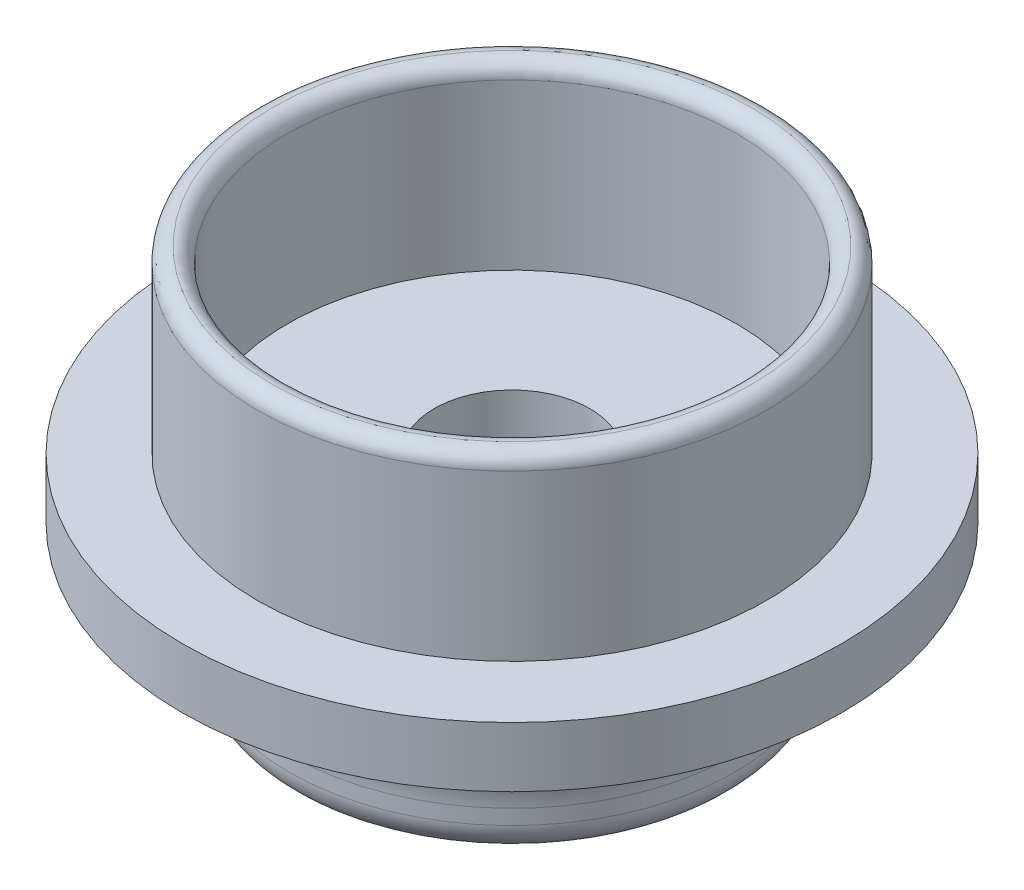
ISO-10303-21;
HEADER;
FILE_DESCRIPTION(('STEP AP214'),'2;1');
FILE_NAME('part.step','',(''),(''),'','','');
FILE_SCHEMA(('AUTOMOTIVE_DESIGN { 1 0 10303 214 1 1 1 1 }'));
ENDSEC;
DATA;
#1=APPLICATION_CONTEXT('core data for automotive mechanical design processes');
#2=APPLICATION_PROTOCOL_DEFINITION('international standard','automotive_design',2000,#1);
#3=PRODUCT_CONTEXT('',#1,'mechanical');
#4=PRODUCT('Part','Part','',(#3));
#5=PRODUCT_RELATED_PRODUCT_CATEGORY('part','',(#4));
#6=PRODUCT_DEFINITION_FORMATION('','',#4);
#7=PRODUCT_DEFINITION_CONTEXT('part definition',#1,'design');
#8=PRODUCT_DEFINITION('design','',#6,#7);
#9=PRODUCT_DEFINITION_SHAPE('','',#8);
#10=(LENGTH_UNIT() NAMED_UNIT(*) SI_UNIT(.MILLI.,.METRE.));
#11=(NAMED_UNIT(*) PLANE_ANGLE_UNIT() SI_UNIT($,.RADIAN.));
#12=(NAMED_UNIT(*) SI_UNIT($,.STERADIAN.) SOLID_ANGLE_UNIT());
#13=UNCERTAINTY_MEASURE_WITH_UNIT(LENGTH_MEASURE(1.E-05),#10,'distance_accuracy_value','');
#14=(GEOMETRIC_REPRESENTATION_CONTEXT(3) GLOBAL_UNCERTAINTY_ASSIGNED_CONTEXT((#13)) GLOBAL_UNIT_ASSIGNED_CONTEXT((#10,
#11,#12)) REPRESENTATION_CONTEXT('',''));
#15=CARTESIAN_POINT('',(0.,0.,0.));
#16=DIRECTION('',(0.,0.,1.));
#17=DIRECTION('',(1.,0.,0.));
#18=AXIS2_PLACEMENT_3D('',#15,#16,#17);
#19=CARTESIAN_POINT('',(0.,0.,0.));
#20=DIRECTION('',(0.,1.,0.));
#21=DIRECTION('',(0.,0.,1.));
#22=AXIS2_PLACEMENT_3D('',#19,#20,#21);
#23=PLANE('',#22);
#24=CARTESIAN_POINT('',(0.,0.,0.));
#25=DIRECTION('',(0.,1.,0.));
#26=DIRECTION('',(0.,0.,1.));
#27=AXIS2_PLACEMENT_3D('',#24,#25,#26);
#28=CIRCLE('',#27,2.6);
#29=CARTESIAN_POINT('',(0.,0.,2.6));
#30=VERTEX_POINT('',#29);
#31=EDGE_CURVE('E148',#30,#30,#28,.T.);
#32=ORIENTED_EDGE('',*,*,#31,.T.);
#33=EDGE_LOOP('',(#32));
#34=FACE_BOUND('',#33,.T.);
#35=DIRECTION('',(0.866025403784438,0.,-0.500000000000001));
#36=VECTOR('',#35,1.);
#37=CARTESIAN_POINT('',(-2.3,0.,-3.98371685740842));
#38=LINE('',#37,#36);
#39=CARTESIAN_POINT('',(-4.6,0.,-2.65581123827228));
#40=VERTEX_POINT('',#39);
#41=CARTESIAN_POINT('',(0.,0.,-5.31162247654456));
#42=VERTEX_POINT('',#41);
#43=EDGE_CURVE('E128',#40,#42,#38,.T.);
#44=ORIENTED_EDGE('',*,*,#43,.T.);
#45=DIRECTION('',(0.866025403784439,0.,0.5));
#46=VECTOR('',#45,1.);
#47=CARTESIAN_POINT('',(2.3,0.,-3.98371685740842));
#48=LINE('',#47,#46);
#49=CARTESIAN_POINT('',(4.6,0.,-2.65581123827228));
#50=VERTEX_POINT('',#49);
#51=EDGE_CURVE('E57',#42,#50,#48,.T.);
#52=ORIENTED_EDGE('',*,*,#51,.T.);
#53=DIRECTION('',(0.,0.,1.));
#54=VECTOR('',#53,1.);
#55=CARTESIAN_POINT('',(4.6,0.,0.));
#56=LINE('',#55,#54);
#57=CARTESIAN_POINT('',(4.6,0.,2.65581123827228));
#58=VERTEX_POINT('',#57);
#59=EDGE_CURVE('E137',#50,#58,#56,.T.);
#60=ORIENTED_EDGE('',*,*,#59,.T.);
#61=DIRECTION('',(-0.866025403784438,0.,0.500000000000001));
#62=VECTOR('',#61,1.);
#63=CARTESIAN_POINT('',(2.3,0.,3.98371685740842));
#64=LINE('',#63,#62);
#65=CARTESIAN_POINT('',(0.,0.,5.31162247654456));
#66=VERTEX_POINT('',#65);
#67=EDGE_CURVE('E135',#58,#66,#64,.T.);
#68=ORIENTED_EDGE('',*,*,#67,.T.);
#69=DIRECTION('',(-0.866025403784439,0.,-0.5));
#70=VECTOR('',#69,1.);
#71=CARTESIAN_POINT('',(-2.3,0.,3.98371685740842));
#72=LINE('',#71,#70);
#73=CARTESIAN_POINT('',(-4.6,0.,2.65581123827228));
#74=VERTEX_POINT('',#73);
#75=EDGE_CURVE('E103',#66,#74,#72,.T.);
#76=ORIENTED_EDGE('',*,*,#75,.T.);
#77=DIRECTION('',(0.,0.,-1.));
#78=VECTOR('',#77,1.);
#79=CARTESIAN_POINT('',(-4.6,0.,0.));
#80=LINE('',#79,#78);
#81=EDGE_CURVE('E131',#74,#40,#80,.T.);
#82=ORIENTED_EDGE('',*,*,#81,.T.);
#83=EDGE_LOOP('',(#44,#52,#60,#68,#76,#82));
#84=FACE_BOUND('',#83,.T.);
#85=ADVANCED_FACE('F41',(#34,#84),#23,.F.);
#86=CARTESIAN_POINT('',(0.,2.,0.));
#87=DIRECTION('',(0.,-1.,0.));
#88=DIRECTION('',(0.,0.,-1.));
#89=AXIS2_PLACEMENT_3D('',#86,#87,#88);
#90=CYLINDRICAL_SURFACE('',#89,11.);
#91=CARTESIAN_POINT('',(0.,2.,0.));
#92=DIRECTION('',(0.,1.,0.));
#93=DIRECTION('',(0.,0.,1.));
#94=AXIS2_PLACEMENT_3D('',#91,#92,#93);
#95=CIRCLE('',#94,11.);
#96=CARTESIAN_POINT('',(0.,2.,11.));
#97=VERTEX_POINT('',#96);
#98=EDGE_CURVE('E157',#97,#97,#95,.T.);
#99=ORIENTED_EDGE('',*,*,#98,.F.);
#100=EDGE_LOOP('',(#99));
#101=FACE_BOUND('',#100,.T.);
#102=CARTESIAN_POINT('',(0.,0.,0.));
#103=DIRECTION('',(0.,1.,0.));
#104=DIRECTION('',(0.,0.,1.));
#105=AXIS2_PLACEMENT_3D('',#102,#103,#104);
#106=CIRCLE('',#105,11.);
#107=CARTESIAN_POINT('',(0.,0.,11.));
#108=VERTEX_POINT('',#107);
#109=EDGE_CURVE('E156',#108,#108,#106,.T.);
#110=ORIENTED_EDGE('',*,*,#109,.T.);
#111=EDGE_LOOP('',(#110));
#112=FACE_BOUND('',#111,.T.);
#113=ADVANCED_FACE('F200',(#101,#112),#90,.T.);
#114=CARTESIAN_POINT('',(0.,2.,0.));
#115=DIRECTION('',(0.,1.,0.));
#116=DIRECTION('',(0.,0.,1.));
#117=AXIS2_PLACEMENT_3D('',#114,#115,#116);
#118=PLANE('',#117);
#119=CARTESIAN_POINT('',(0.,2.,0.));
#120=DIRECTION('',(0.,1.,0.));
#121=DIRECTION('',(0.,0.,1.));
#122=AXIS2_PLACEMENT_3D('',#119,#120,#121);
#123=CIRCLE('',#122,8.5);
#124=CARTESIAN_POINT('',(0.,2.,8.5));
#125=VERTEX_POINT('',#124);
#126=EDGE_CURVE('E151',#125,#125,#123,.T.);
#127=ORIENTED_EDGE('',*,*,#126,.F.);
#128=EDGE_LOOP('',(#127));
#129=FACE_BOUND('',#128,.T.);
#130=ORIENTED_EDGE('',*,*,#98,.T.);
#131=EDGE_LOOP('',(#130));
#132=FACE_BOUND('',#131,.T.);
#133=ADVANCED_FACE('F209',(#129,#132),#118,.T.);
#134=CARTESIAN_POINT('',(0.,0.,0.));
#135=DIRECTION('',(0.,1.,0.));
#136=DIRECTION('',(0.,0.,1.));
#137=AXIS2_PLACEMENT_3D('',#134,#135,#136);
#138=CIRCLE('',#137,10.4336220595155);
#139=CARTESIAN_POINT('',(0.,0.,10.4336220595155));
#140=VERTEX_POINT('',#139);
#141=EDGE_CURVE('E168',#140,#140,#138,.T.);
#142=ORIENTED_EDGE('',*,*,#141,.T.);
#143=EDGE_LOOP('',(#142));
#144=FACE_BOUND('',#143,.T.);
#145=ORIENTED_EDGE('',*,*,#109,.F.);
#146=EDGE_LOOP('',(#145));
#147=FACE_BOUND('',#146,.T.);
#148=ADVANCED_FACE('F203',(#144,#147),#23,.F.);
#149=CARTESIAN_POINT('',(0.,8.,0.));
#150=DIRECTION('',(0.,-1.,0.));
#151=DIRECTION('',(0.,0.,-1.));
#152=AXIS2_PLACEMENT_3D('',#149,#150,#151);
#153=CYLINDRICAL_SURFACE('',#152,8.5);
#154=CARTESIAN_POINT('',(0.,7.5,0.));
#155=DIRECTION('',(0.,1.,0.));
#156=DIRECTION('',(0.,0.,1.));
#157=AXIS2_PLACEMENT_3D('',#154,#155,#156);
#158=CIRCLE('',#157,8.5);
#159=CARTESIAN_POINT('',(0.,7.5,8.5));
#160=VERTEX_POINT('',#159);
#161=EDGE_CURVE('E50',#160,#160,#158,.F.);
#162=ORIENTED_EDGE('',*,*,#161,.T.);
#163=EDGE_LOOP('',(#162));
#164=FACE_BOUND('',#163,.T.);
#165=ORIENTED_EDGE('',*,*,#126,.T.);
#166=EDGE_LOOP('',(#165));
#167=FACE_BOUND('',#166,.T.);
#168=ADVANCED_FACE('F180',(#164,#167),#153,.T.);
#169=CARTESIAN_POINT('',(0.,8.,0.));
#170=DIRECTION('',(0.,-1.,0.));
#171=DIRECTION('',(0.,0.,-1.));
#172=AXIS2_PLACEMENT_3D('',#169,#170,#171);
#173=CYLINDRICAL_SURFACE('',#172,7.5);
#174=CARTESIAN_POINT('',(0.,7.5,0.));
#175=DIRECTION('',(0.,1.,0.));
#176=DIRECTION('',(0.,0.,1.));
#177=AXIS2_PLACEMENT_3D('',#174,#175,#176);
#178=CIRCLE('',#177,7.5);
#179=CARTESIAN_POINT('',(0.,7.5,7.5));
#180=VERTEX_POINT('',#179);
#181=EDGE_CURVE('E11',#180,#180,#178,.T.);
#182=ORIENTED_EDGE('',*,*,#181,.T.);
#183=EDGE_LOOP('',(#182));
#184=FACE_BOUND('',#183,.T.);
#185=CARTESIAN_POINT('',(0.,2.,0.));
#186=DIRECTION('',(0.,1.,0.));
#187=DIRECTION('',(0.,0.,1.));
#188=AXIS2_PLACEMENT_3D('',#185,#186,#187);
#189=CIRCLE('',#188,7.5);
#190=CARTESIAN_POINT('',(0.,2.,7.5));
#191=VERTEX_POINT('',#190);
#192=EDGE_CURVE('E160',#191,#191,#189,.F.);
#193=ORIENTED_EDGE('',*,*,#192,.T.);
#194=EDGE_LOOP('',(#193));
#195=FACE_BOUND('',#194,.T.);
#196=ADVANCED_FACE('F221',(#184,#195),#173,.F.);
#197=CARTESIAN_POINT('',(0.,2.,0.));
#198=DIRECTION('',(0.,1.,0.));
#199=DIRECTION('',(0.,0.,1.));
#200=AXIS2_PLACEMENT_3D('',#197,#198,#199);
#201=CIRCLE('',#200,2.6);
#202=CARTESIAN_POINT('',(0.,2.,2.6));
#203=VERTEX_POINT('',#202);
#204=EDGE_CURVE('E147',#203,#203,#201,.T.);
#205=ORIENTED_EDGE('',*,*,#204,.F.);
#206=EDGE_LOOP('',(#205));
#207=FACE_BOUND('',#206,.T.);
#208=ORIENTED_EDGE('',*,*,#192,.F.);
#209=EDGE_LOOP('',(#208));
#210=FACE_BOUND('',#209,.T.);
#211=ADVANCED_FACE('F225',(#207,#210),#118,.T.);
#212=CARTESIAN_POINT('',(0.,0.,0.));
#213=DIRECTION('',(0.,1.,0.));
#214=DIRECTION('',(0.,0.,1.));
#215=AXIS2_PLACEMENT_3D('',#212,#213,#214);
#216=CYLINDRICAL_SURFACE('',#215,2.6);
#217=ORIENTED_EDGE('',*,*,#31,.F.);
#218=EDGE_LOOP('',(#217));
#219=FACE_BOUND('',#218,.T.);
#220=ORIENTED_EDGE('',*,*,#204,.T.);
#221=EDGE_LOOP('',(#220));
#222=FACE_BOUND('',#221,.T.);
#223=ADVANCED_FACE('F264',(#219,#222),#216,.F.);
#224=CARTESIAN_POINT('',(2.3,-4.5,-3.98371685740842));
#225=DIRECTION('',(-0.5,0.,0.866025403784439));
#226=DIRECTION('',(0.866025403784439,0.,0.5));
#227=AXIS2_PLACEMENT_3D('',#224,#225,#226);
#228=PLANE('',#227);
#229=ORIENTED_EDGE('',*,*,#51,.F.);
#230=DIRECTION('',(0.,1.,0.));
#231=VECTOR('',#230,1.);
#232=CARTESIAN_POINT('',(0.,-4.5,-5.31162247654456));
#233=LINE('',#232,#231);
#234=CARTESIAN_POINT('',(0.,-4.5,-5.31162247654456));
#235=VERTEX_POINT('',#234);
#236=EDGE_CURVE('E87',#235,#42,#233,.T.);
#237=ORIENTED_EDGE('',*,*,#236,.F.);
#238=DIRECTION('',(0.866025403784439,0.,0.5));
#239=VECTOR('',#238,1.);
#240=CARTESIAN_POINT('',(2.3,-4.5,-3.98371685740842));
#241=LINE('',#240,#239);
#242=CARTESIAN_POINT('',(4.6,-4.5,-2.65581123827228));
#243=VERTEX_POINT('',#242);
#244=EDGE_CURVE('E140',#235,#243,#241,.T.);
#245=ORIENTED_EDGE('',*,*,#244,.T.);
#246=DIRECTION('',(0.,1.,0.));
#247=VECTOR('',#246,1.);
#248=CARTESIAN_POINT('',(4.6,-4.5,-2.65581123827228));
#249=LINE('',#248,#247);
#250=EDGE_CURVE('E65',#243,#50,#249,.T.);
#251=ORIENTED_EDGE('',*,*,#250,.T.);
#252=EDGE_LOOP('',(#229,#237,#245,#251));
#253=FACE_BOUND('',#252,.T.);
#254=ADVANCED_FACE('F260',(#253),#228,.T.);
#255=CARTESIAN_POINT('',(-2.3,-4.5,-3.98371685740842));
#256=DIRECTION('',(0.500000000000001,0.,0.866025403784438));
#257=DIRECTION('',(0.866025403784438,0.,-0.500000000000001));
#258=AXIS2_PLACEMENT_3D('',#255,#256,#257);
#259=PLANE('',#258);
#260=ORIENTED_EDGE('',*,*,#43,.F.);
#261=DIRECTION('',(0.,1.,0.));
#262=VECTOR('',#261,1.);
#263=CARTESIAN_POINT('',(-4.6,-4.5,-2.65581123827228));
#264=LINE('',#263,#262);
#265=CARTESIAN_POINT('',(-4.6,-4.5,-2.65581123827228));
#266=VERTEX_POINT('',#265);
#267=EDGE_CURVE('E144',#266,#40,#264,.T.);
#268=ORIENTED_EDGE('',*,*,#267,.F.);
#269=DIRECTION('',(0.866025403784438,0.,-0.500000000000001));
#270=VECTOR('',#269,1.);
#271=CARTESIAN_POINT('',(-2.3,-4.5,-3.98371685740842));
#272=LINE('',#271,#270);
#273=EDGE_CURVE('E429',#266,#235,#272,.T.);
#274=ORIENTED_EDGE('',*,*,#273,.T.);
#275=ORIENTED_EDGE('',*,*,#236,.T.);
#276=EDGE_LOOP('',(#260,#268,#274,#275));
#277=FACE_BOUND('',#276,.T.);
#278=ADVANCED_FACE('F256',(#277),#259,.T.);
#279=CARTESIAN_POINT('',(-4.6,-4.5,0.));
#280=DIRECTION('',(1.,0.,0.));
#281=DIRECTION('',(0.,0.,-1.));
#282=AXIS2_PLACEMENT_3D('',#279,#280,#281);
#283=PLANE('',#282);
#284=ORIENTED_EDGE('',*,*,#81,.F.);
#285=DIRECTION('',(0.,1.,0.));
#286=VECTOR('',#285,1.);
#287=CARTESIAN_POINT('',(-4.6,-4.5,2.65581123827228));
#288=LINE('',#287,#286);
#289=CARTESIAN_POINT('',(-4.6,-4.5,2.65581123827228));
#290=VERTEX_POINT('',#289);
#291=EDGE_CURVE('E108',#290,#74,#288,.T.);
#292=ORIENTED_EDGE('',*,*,#291,.F.);
#293=DIRECTION('',(0.,0.,-1.));
#294=VECTOR('',#293,1.);
#295=CARTESIAN_POINT('',(-4.6,-4.5,0.));
#296=LINE('',#295,#294);
#297=EDGE_CURVE('E119',#290,#266,#296,.T.);
#298=ORIENTED_EDGE('',*,*,#297,.T.);
#299=ORIENTED_EDGE('',*,*,#267,.T.);
#300=EDGE_LOOP('',(#284,#292,#298,#299));
#301=FACE_BOUND('',#300,.T.);
#302=ADVANCED_FACE('F253',(#301),#283,.T.);
#303=CARTESIAN_POINT('',(-2.3,-4.5,3.98371685740842));
#304=DIRECTION('',(0.5,0.,-0.866025403784439));
#305=DIRECTION('',(-0.866025403784439,0.,-0.5));
#306=AXIS2_PLACEMENT_3D('',#303,#304,#305);
#307=PLANE('',#306);
#308=ORIENTED_EDGE('',*,*,#75,.F.);
#309=DIRECTION('',(0.,1.,0.));
#310=VECTOR('',#309,1.);
#311=CARTESIAN_POINT('',(0.,-4.5,5.31162247654456));
#312=LINE('',#311,#310);
#313=CARTESIAN_POINT('',(0.,-4.5,5.31162247654456));
#314=VERTEX_POINT('',#313);
#315=EDGE_CURVE('E98',#314,#66,#312,.T.);
#316=ORIENTED_EDGE('',*,*,#315,.F.);
#317=DIRECTION('',(-0.866025403784439,0.,-0.5));
#318=VECTOR('',#317,1.);
#319=CARTESIAN_POINT('',(-2.3,-4.5,3.98371685740842));
#320=LINE('',#319,#318);
#321=EDGE_CURVE('E101',#314,#290,#320,.T.);
#322=ORIENTED_EDGE('',*,*,#321,.T.);
#323=ORIENTED_EDGE('',*,*,#291,.T.);
#324=EDGE_LOOP('',(#308,#316,#322,#323));
#325=FACE_BOUND('',#324,.T.);
#326=ADVANCED_FACE('F100',(#325),#307,.T.);
#327=CARTESIAN_POINT('',(2.3,-4.5,3.98371685740842));
#328=DIRECTION('',(-0.500000000000001,0.,-0.866025403784438));
#329=DIRECTION('',(-0.866025403784438,0.,0.500000000000001));
#330=AXIS2_PLACEMENT_3D('',#327,#328,#329);
#331=PLANE('',#330);
#332=ORIENTED_EDGE('',*,*,#67,.F.);
#333=DIRECTION('',(0.,1.,0.));
#334=VECTOR('',#333,1.);
#335=CARTESIAN_POINT('',(4.6,-4.5,2.65581123827228));
#336=LINE('',#335,#334);
#337=CARTESIAN_POINT('',(4.6,-4.5,2.65581123827228));
#338=VERTEX_POINT('',#337);
#339=EDGE_CURVE('E109',#338,#58,#336,.T.);
#340=ORIENTED_EDGE('',*,*,#339,.F.);
#341=DIRECTION('',(-0.866025403784438,0.,0.500000000000001));
#342=VECTOR('',#341,1.);
#343=CARTESIAN_POINT('',(2.3,-4.5,3.98371685740842));
#344=LINE('',#343,#342);
#345=EDGE_CURVE('E116',#338,#314,#344,.T.);
#346=ORIENTED_EDGE('',*,*,#345,.T.);
#347=ORIENTED_EDGE('',*,*,#315,.T.);
#348=EDGE_LOOP('',(#332,#340,#346,#347));
#349=FACE_BOUND('',#348,.T.);
#350=ADVANCED_FACE('F121',(#349),#331,.T.);
#351=CARTESIAN_POINT('',(4.6,-4.5,0.));
#352=DIRECTION('',(-1.,0.,0.));
#353=DIRECTION('',(0.,0.,1.));
#354=AXIS2_PLACEMENT_3D('',#351,#352,#353);
#355=PLANE('',#354);
#356=ORIENTED_EDGE('',*,*,#59,.F.);
#357=ORIENTED_EDGE('',*,*,#250,.F.);
#358=DIRECTION('',(0.,0.,1.));
#359=VECTOR('',#358,1.);
#360=CARTESIAN_POINT('',(4.6,-4.5,0.));
#361=LINE('',#360,#359);
#362=EDGE_CURVE('E122',#243,#338,#361,.T.);
#363=ORIENTED_EDGE('',*,*,#362,.T.);
#364=ORIENTED_EDGE('',*,*,#339,.T.);
#365=EDGE_LOOP('',(#356,#357,#363,#364));
#366=FACE_BOUND('',#365,.T.);
#367=ADVANCED_FACE('F238',(#366),#355,.T.);
#368=CARTESIAN_POINT('',(0.,-4.5,0.));
#369=DIRECTION('',(0.,1.,0.));
#370=DIRECTION('',(0.,0.,1.));
#371=AXIS2_PLACEMENT_3D('',#368,#369,#370);
#372=CYLINDRICAL_SURFACE('',#371,7.4336220595155);
#373=CARTESIAN_POINT('',(0.,-3.5,0.));
#374=DIRECTION('',(0.,-1.,0.));
#375=DIRECTION('',(0.,0.,-1.));
#376=AXIS2_PLACEMENT_3D('',#373,#374,#375);
#377=CIRCLE('',#376,7.4336220595155);
#378=CARTESIAN_POINT('',(0.,-3.5,-7.4336220595155));
#379=VERTEX_POINT('',#378);
#380=EDGE_CURVE('E174',#379,#379,#377,.F.);
#381=ORIENTED_EDGE('',*,*,#380,.T.);
#382=EDGE_LOOP('',(#381));
#383=FACE_BOUND('',#382,.T.);
#384=CARTESIAN_POINT('',(0.,-3.,0.));
#385=DIRECTION('',(0.,1.,0.));
#386=DIRECTION('',(0.,0.,1.));
#387=AXIS2_PLACEMENT_3D('',#384,#385,#386);
#388=CIRCLE('',#387,7.4336220595155);
#389=CARTESIAN_POINT('',(0.,-3.,7.4336220595155));
#390=VERTEX_POINT('',#389);
#391=EDGE_CURVE('E165',#390,#390,#388,.F.);
#392=ORIENTED_EDGE('',*,*,#391,.T.);
#393=EDGE_LOOP('',(#392));
#394=FACE_BOUND('',#393,.T.);
#395=ADVANCED_FACE('F236',(#383,#394),#372,.T.);
#396=CARTESIAN_POINT('',(0.,-4.5,0.));
#397=DIRECTION('',(0.,-1.,0.));
#398=DIRECTION('',(0.,0.,-1.));
#399=AXIS2_PLACEMENT_3D('',#396,#397,#398);
#400=PLANE('',#399);
#401=CARTESIAN_POINT('',(0.,-4.5,0.));
#402=DIRECTION('',(0.,-1.,0.));
#403=DIRECTION('',(0.,0.,-1.));
#404=AXIS2_PLACEMENT_3D('',#401,#402,#403);
#405=CIRCLE('',#404,6.4336220595155);
#406=CARTESIAN_POINT('',(0.,-4.5,-6.4336220595155));
#407=VERTEX_POINT('',#406);
#408=EDGE_CURVE('E171',#407,#407,#405,.T.);
#409=ORIENTED_EDGE('',*,*,#408,.T.);
#410=EDGE_LOOP('',(#409));
#411=FACE_BOUND('',#410,.T.);
#412=ORIENTED_EDGE('',*,*,#244,.F.);
#413=ORIENTED_EDGE('',*,*,#273,.F.);
#414=ORIENTED_EDGE('',*,*,#297,.F.);
#415=ORIENTED_EDGE('',*,*,#321,.F.);
#416=ORIENTED_EDGE('',*,*,#345,.F.);
#417=ORIENTED_EDGE('',*,*,#362,.F.);
#418=EDGE_LOOP('',(#412,#413,#414,#415,#416,#417));
#419=FACE_BOUND('',#418,.T.);
#420=ADVANCED_FACE('F114',(#411,#419),#400,.T.);
#421=CARTESIAN_POINT('',(0.,-3.,0.));
#422=DIRECTION('',(0.,1.,0.));
#423=DIRECTION('',(0.,0.,1.));
#424=AXIS2_PLACEMENT_3D('',#421,#422,#423);
#425=TOROIDAL_SURFACE('',#424,10.4336220595155,3.);
#426=ORIENTED_EDGE('',*,*,#141,.F.);
#427=EDGE_LOOP('',(#426));
#428=FACE_BOUND('',#427,.T.);
#429=ORIENTED_EDGE('',*,*,#391,.F.);
#430=EDGE_LOOP('',(#429));
#431=FACE_BOUND('',#430,.T.);
#432=ADVANCED_FACE('F195',(#428,#431),#425,.F.);
#433=CARTESIAN_POINT('',(0.,-3.5,0.));
#434=DIRECTION('',(0.,-1.,0.));
#435=DIRECTION('',(0.,0.,-1.));
#436=AXIS2_PLACEMENT_3D('',#433,#434,#435);
#437=TOROIDAL_SURFACE('',#436,6.4336220595155,1.);
#438=ORIENTED_EDGE('',*,*,#380,.F.);
#439=EDGE_LOOP('',(#438));
#440=FACE_BOUND('',#439,.T.);
#441=ORIENTED_EDGE('',*,*,#408,.F.);
#442=EDGE_LOOP('',(#441));
#443=FACE_BOUND('',#442,.T.);
#444=ADVANCED_FACE('F190',(#440,#443),#437,.T.);
#445=CARTESIAN_POINT('',(0.,7.5,0.));
#446=DIRECTION('',(0.,1.,0.));
#447=DIRECTION('',(0.,0.,1.));
#448=AXIS2_PLACEMENT_3D('',#445,#446,#447);
#449=TOROIDAL_SURFACE('',#448,8.,0.5);
#450=ORIENTED_EDGE('',*,*,#181,.F.);
#451=EDGE_LOOP('',(#450));
#452=FACE_BOUND('',#451,.T.);
#453=CARTESIAN_POINT('',(0.,8.,0.));
#454=DIRECTION('',(0.,1.,0.));
#455=DIRECTION('',(0.,0.,1.));
#456=AXIS2_PLACEMENT_3D('',#453,#454,#455);
#457=CIRCLE('',#456,8.);
#458=CARTESIAN_POINT('',(0.,8.,8.));
#459=VERTEX_POINT('',#458);
#460=EDGE_CURVE('E45',#459,#459,#457,.F.);
#461=ORIENTED_EDGE('',*,*,#460,.F.);
#462=EDGE_LOOP('',(#461));
#463=FACE_BOUND('',#462,.T.);
#464=ADVANCED_FACE('F43',(#452,#463),#449,.T.);
#465=CARTESIAN_POINT('',(0.,7.5,0.));
#466=DIRECTION('',(0.,1.,0.));
#467=DIRECTION('',(0.,0.,1.));
#468=AXIS2_PLACEMENT_3D('',#465,#466,#467);
#469=TOROIDAL_SURFACE('',#468,8.,0.5);
#470=ORIENTED_EDGE('',*,*,#161,.F.);
#471=EDGE_LOOP('',(#470));
#472=FACE_BOUND('',#471,.T.);
#473=ORIENTED_EDGE('',*,*,#460,.T.);
#474=EDGE_LOOP('',(#473));
#475=FACE_BOUND('',#474,.T.);
#476=ADVANCED_FACE('F183',(#472,#475),#469,.T.);
#477=CLOSED_SHELL('',(#85,#113,#133,#148,#168,#196,#211,#223,#254,#278,#302,#326,#350,#367,#395,
#420,#432,#444,#464,#476));
#478=MANIFOLD_SOLID_BREP('B2',#477);
#479=ADVANCED_BREP_SHAPE_REPRESENTATION('',(#18,#478),#14);
#480=SHAPE_DEFINITION_REPRESENTATION(#9,#479);
ENDSEC;
END-ISO-10303-21;
